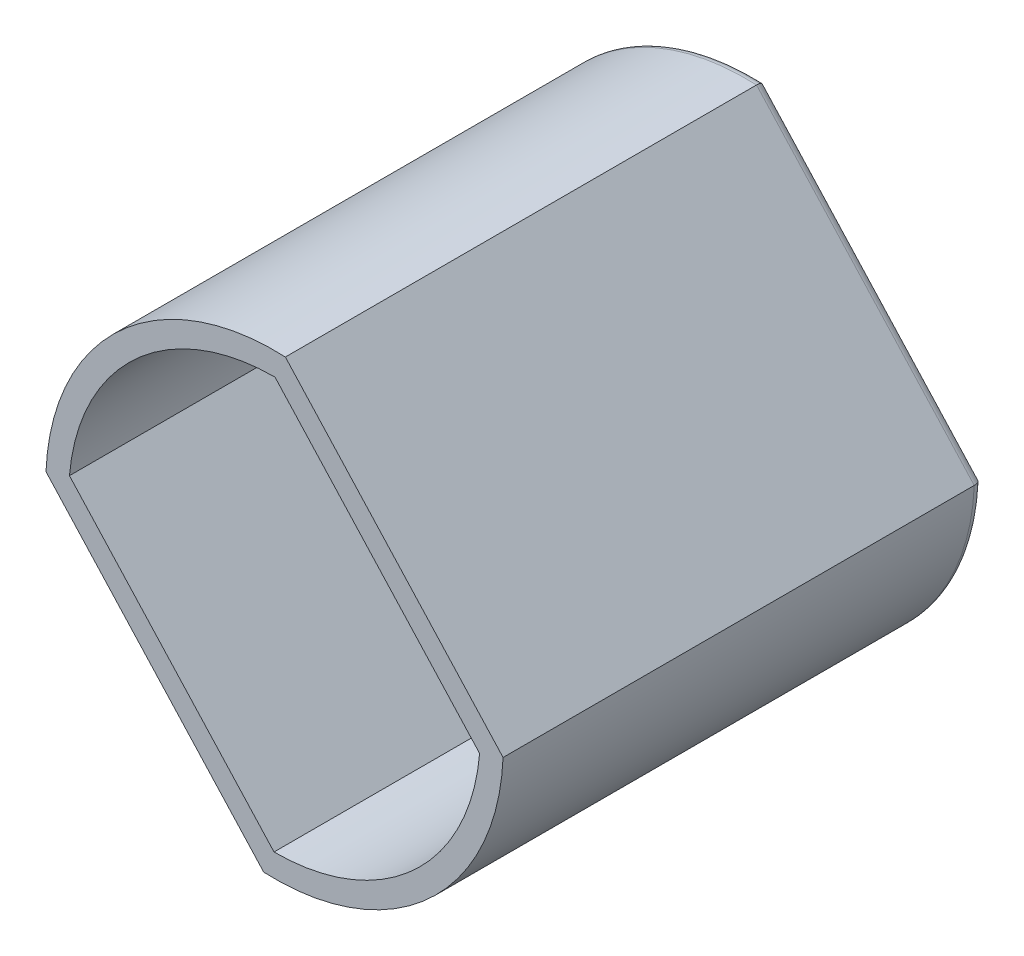
ISO-10303-21;
HEADER;
FILE_DESCRIPTION(('STEP AP214'),'2;1');
FILE_NAME('part.step','',(''),(''),'','','');
FILE_SCHEMA(('AUTOMOTIVE_DESIGN { 1 0 10303 214 1 1 1 1 }'));
ENDSEC;
DATA;
#1=APPLICATION_CONTEXT('core data for automotive mechanical design processes');
#2=APPLICATION_PROTOCOL_DEFINITION('international standard','automotive_design',2000,#1);
#3=PRODUCT_CONTEXT('',#1,'mechanical');
#4=PRODUCT('Part','Part','',(#3));
#5=PRODUCT_RELATED_PRODUCT_CATEGORY('part','',(#4));
#6=PRODUCT_DEFINITION_FORMATION('','',#4);
#7=PRODUCT_DEFINITION_CONTEXT('part definition',#1,'design');
#8=PRODUCT_DEFINITION('design','',#6,#7);
#9=PRODUCT_DEFINITION_SHAPE('','',#8);
#10=(LENGTH_UNIT() NAMED_UNIT(*) SI_UNIT(.MILLI.,.METRE.));
#11=(NAMED_UNIT(*) PLANE_ANGLE_UNIT() SI_UNIT($,.RADIAN.));
#12=(NAMED_UNIT(*) SI_UNIT($,.STERADIAN.) SOLID_ANGLE_UNIT());
#13=UNCERTAINTY_MEASURE_WITH_UNIT(LENGTH_MEASURE(1.E-05),#10,'distance_accuracy_value','');
#14=(GEOMETRIC_REPRESENTATION_CONTEXT(3) GLOBAL_UNCERTAINTY_ASSIGNED_CONTEXT((#13)) GLOBAL_UNIT_ASSIGNED_CONTEXT((#10,
#11,#12)) REPRESENTATION_CONTEXT('',''));
#15=CARTESIAN_POINT('',(0.,0.,0.));
#16=DIRECTION('',(0.,0.,1.));
#17=DIRECTION('',(1.,0.,0.));
#18=AXIS2_PLACEMENT_3D('',#15,#16,#17);
#19=CARTESIAN_POINT('',(0.,0.,-1.));
#20=DIRECTION('',(0.,0.,-1.));
#21=DIRECTION('',(-1.,0.,0.));
#22=AXIS2_PLACEMENT_3D('',#19,#20,#21);
#23=PLANE('',#22);
#24=CARTESIAN_POINT('',(0.,0.,-1.));
#25=DIRECTION('',(0.,0.,-1.));
#26=DIRECTION('',(-1.,0.,0.));
#27=AXIS2_PLACEMENT_3D('',#24,#25,#26);
#28=CIRCLE('',#27,9.6);
#29=CARTESIAN_POINT('',(9.58362211965735,-0.560523922428392,-1.));
#30=VERTEX_POINT('',#29);
#31=CARTESIAN_POINT('',(-0.290729810336729,-9.5955967077291,-1.));
#32=VERTEX_POINT('',#31);
#33=EDGE_CURVE('E175',#30,#32,#28,.T.);
#34=ORIENTED_EDGE('',*,*,#33,.T.);
#35=DIRECTION('',(-0.675057843193205,0.737764805573794,0.));
#36=VECTOR('',#35,1.);
#37=CARTESIAN_POINT('',(-9.69633375950913,0.683705486644895,-1.));
#38=LINE('',#37,#36);
#39=CARTESIAN_POINT('',(-9.58362211965735,0.560523922428391,-1.));
#40=VERTEX_POINT('',#39);
#41=EDGE_CURVE('E177',#32,#40,#38,.T.);
#42=ORIENTED_EDGE('',*,*,#41,.T.);
#43=CARTESIAN_POINT('',(0.,0.,-1.));
#44=DIRECTION('',(0.,0.,-1.));
#45=DIRECTION('',(-1.,0.,0.));
#46=AXIS2_PLACEMENT_3D('',#43,#44,#45);
#47=CIRCLE('',#46,9.6);
#48=CARTESIAN_POINT('',(0.29072981033673,9.5955967077291,-1.));
#49=VERTEX_POINT('',#48);
#50=EDGE_CURVE('E171',#40,#49,#47,.T.);
#51=ORIENTED_EDGE('',*,*,#50,.T.);
#52=DIRECTION('',(0.675057843193205,-0.737764805573794,0.));
#53=VECTOR('',#52,1.);
#54=CARTESIAN_POINT('',(9.69633375950913,-0.683705486644895,-1.));
#55=LINE('',#54,#53);
#56=EDGE_CURVE('E173',#49,#30,#55,.T.);
#57=ORIENTED_EDGE('',*,*,#56,.T.);
#58=EDGE_LOOP('',(#34,#42,#51,#57));
#59=FACE_BOUND('',#58,.T.);
#60=CARTESIAN_POINT('',(0.,0.,-1.));
#61=DIRECTION('',(0.,0.,-1.));
#62=DIRECTION('',(-1.,0.,0.));
#63=AXIS2_PLACEMENT_3D('',#60,#61,#62);
#64=CIRCLE('',#63,2.);
#65=CARTESIAN_POINT('',(-2.,0.,-1.));
#66=VERTEX_POINT('',#65);
#67=EDGE_CURVE('E348',#66,#66,#64,.T.);
#68=ORIENTED_EDGE('',*,*,#67,.F.);
#69=EDGE_LOOP('',(#68));
#70=FACE_BOUND('',#69,.T.);
#71=ADVANCED_FACE('F33',(#59,#70),#23,.T.);
#72=CARTESIAN_POINT('',(0.,0.,20.));
#73=DIRECTION('',(0.,0.,1.));
#74=DIRECTION('',(1.,0.,0.));
#75=AXIS2_PLACEMENT_3D('',#72,#73,#74);
#76=PLANE('',#75);
#77=CARTESIAN_POINT('',(0.,0.,20.));
#78=DIRECTION('',(0.,0.,1.));
#79=DIRECTION('',(1.,0.,0.));
#80=AXIS2_PLACEMENT_3D('',#77,#78,#79);
#81=CIRCLE('',#80,10.);
#82=CARTESIAN_POINT('',(0.473124092714464,9.98880140922289,20.));
#83=VERTEX_POINT('',#82);
#84=CARTESIAN_POINT('',(-9.99143968173865,0.413682349367613,20.));
#85=VERTEX_POINT('',#84);
#86=EDGE_CURVE('E153',#83,#85,#81,.T.);
#87=ORIENTED_EDGE('',*,*,#86,.T.);
#88=DIRECTION('',(0.675057843193205,-0.737764805573794,0.));
#89=VECTOR('',#88,1.);
#90=CARTESIAN_POINT('',(-9.99143968173865,0.413682349367613,20.));
#91=LINE('',#90,#89);
#92=CARTESIAN_POINT('',(-0.47312409271446,-9.98880140922289,20.));
#93=VERTEX_POINT('',#92);
#94=EDGE_CURVE('E156',#85,#93,#91,.T.);
#95=ORIENTED_EDGE('',*,*,#94,.T.);
#96=CARTESIAN_POINT('',(0.,0.,20.));
#97=DIRECTION('',(0.,0.,1.));
#98=DIRECTION('',(1.,0.,0.));
#99=AXIS2_PLACEMENT_3D('',#96,#97,#98);
#100=CIRCLE('',#99,10.);
#101=CARTESIAN_POINT('',(9.99143968173865,-0.413682349367619,20.));
#102=VERTEX_POINT('',#101);
#103=EDGE_CURVE('E158',#93,#102,#100,.T.);
#104=ORIENTED_EDGE('',*,*,#103,.T.);
#105=DIRECTION('',(-0.675057843193205,0.737764805573794,0.));
#106=VECTOR('',#105,1.);
#107=CARTESIAN_POINT('',(9.99143968173865,-0.413682349367613,20.));
#108=LINE('',#107,#106);
#109=EDGE_CURVE('E160',#102,#83,#108,.T.);
#110=ORIENTED_EDGE('',*,*,#109,.T.);
#111=EDGE_LOOP('',(#87,#95,#104,#110));
#112=FACE_BOUND('',#111,.T.);
#113=DIRECTION('',(0.675057843193205,-0.737764805573794,0.));
#114=VECTOR('',#113,1.);
#115=CARTESIAN_POINT('',(-8.96657257111127,0.77496859742505,20.));
#116=LINE('',#115,#114);
#117=CARTESIAN_POINT('',(-8.96657257111127,0.77496859742505,20.));
#118=VERTEX_POINT('',#117);
#119=CARTESIAN_POINT('',(-0.0224615921942456,-8.99997197089392,20.));
#120=VERTEX_POINT('',#119);
#121=EDGE_CURVE('E144',#118,#120,#116,.T.);
#122=ORIENTED_EDGE('',*,*,#121,.F.);
#123=CARTESIAN_POINT('',(0.,0.,20.));
#124=DIRECTION('',(0.,0.,1.));
#125=DIRECTION('',(1.,0.,0.));
#126=AXIS2_PLACEMENT_3D('',#123,#124,#125);
#127=CIRCLE('',#126,9.);
#128=CARTESIAN_POINT('',(0.0224615921942482,8.99997197089392,20.));
#129=VERTEX_POINT('',#128);
#130=EDGE_CURVE('E142',#129,#118,#127,.T.);
#131=ORIENTED_EDGE('',*,*,#130,.F.);
#132=DIRECTION('',(-0.675057843193205,0.737764805573794,0.));
#133=VECTOR('',#132,1.);
#134=CARTESIAN_POINT('',(8.96657257111127,-0.77496859742505,20.));
#135=LINE('',#134,#133);
#136=CARTESIAN_POINT('',(8.96657257111127,-0.774968597425052,20.));
#137=VERTEX_POINT('',#136);
#138=EDGE_CURVE('E124',#137,#129,#135,.T.);
#139=ORIENTED_EDGE('',*,*,#138,.F.);
#140=CARTESIAN_POINT('',(0.,0.,20.));
#141=DIRECTION('',(0.,0.,1.));
#142=DIRECTION('',(1.,0.,0.));
#143=AXIS2_PLACEMENT_3D('',#140,#141,#142);
#144=CIRCLE('',#143,9.);
#145=EDGE_CURVE('E357',#120,#137,#144,.T.);
#146=ORIENTED_EDGE('',*,*,#145,.F.);
#147=EDGE_LOOP('',(#122,#131,#139,#146));
#148=FACE_BOUND('',#147,.T.);
#149=ADVANCED_FACE('F232',(#112,#148),#76,.T.);
#150=CARTESIAN_POINT('',(0.,0.,20.));
#151=DIRECTION('',(0.,0.,-1.));
#152=DIRECTION('',(-1.,0.,0.));
#153=AXIS2_PLACEMENT_3D('',#150,#151,#152);
#154=CYLINDRICAL_SURFACE('',#153,10.);
#155=DIRECTION('',(0.,0.,-1.));
#156=VECTOR('',#155,1.);
#157=CARTESIAN_POINT('',(0.473124092714464,9.98880140922289,20.));
#158=LINE('',#157,#156);
#159=CARTESIAN_POINT('',(0.473124092714464,9.98880140922289,-0.6));
#160=VERTEX_POINT('',#159);
#161=EDGE_CURVE('E162',#83,#160,#158,.T.);
#162=ORIENTED_EDGE('',*,*,#161,.T.);
#163=CARTESIAN_POINT('',(0.,0.,-0.6));
#164=DIRECTION('',(0.,0.,-1.));
#165=DIRECTION('',(-1.,0.,0.));
#166=AXIS2_PLACEMENT_3D('',#163,#164,#165);
#167=CIRCLE('',#166,10.);
#168=CARTESIAN_POINT('',(-9.99143968173865,0.413682349367613,-0.6));
#169=VERTEX_POINT('',#168);
#170=EDGE_CURVE('E11',#160,#169,#167,.F.);
#171=ORIENTED_EDGE('',*,*,#170,.T.);
#172=DIRECTION('',(0.,0.,-1.));
#173=VECTOR('',#172,1.);
#174=CARTESIAN_POINT('',(-9.99143968173865,0.413682349367613,20.));
#175=LINE('',#174,#173);
#176=EDGE_CURVE('E168',#85,#169,#175,.T.);
#177=ORIENTED_EDGE('',*,*,#176,.F.);
#178=ORIENTED_EDGE('',*,*,#86,.F.);
#179=EDGE_LOOP('',(#162,#171,#177,#178));
#180=FACE_BOUND('',#179,.T.);
#181=ADVANCED_FACE('F236',(#180),#154,.T.);
#182=CARTESIAN_POINT('',(-9.99143968173865,0.413682349367613,20.));
#183=DIRECTION('',(0.737764805573794,0.675057843193205,0.));
#184=DIRECTION('',(-0.675057843193205,0.737764805573794,0.));
#185=AXIS2_PLACEMENT_3D('',#182,#183,#184);
#186=PLANE('',#185);
#187=ORIENTED_EDGE('',*,*,#176,.T.);
#188=DIRECTION('',(-0.675057843193205,0.737764805573794,0.));
#189=VECTOR('',#188,1.);
#190=CARTESIAN_POINT('',(-0.473124092714459,-9.98880140922289,-0.6));
#191=LINE('',#190,#189);
#192=CARTESIAN_POINT('',(-0.47312409271446,-9.98880140922289,-0.6));
#193=VERTEX_POINT('',#192);
#194=EDGE_CURVE('E180',#169,#193,#191,.F.);
#195=ORIENTED_EDGE('',*,*,#194,.T.);
#196=DIRECTION('',(0.,0.,-1.));
#197=VECTOR('',#196,1.);
#198=CARTESIAN_POINT('',(-0.47312409271446,-9.98880140922289,20.));
#199=LINE('',#198,#197);
#200=EDGE_CURVE('E166',#93,#193,#199,.T.);
#201=ORIENTED_EDGE('',*,*,#200,.F.);
#202=ORIENTED_EDGE('',*,*,#94,.F.);
#203=EDGE_LOOP('',(#187,#195,#201,#202));
#204=FACE_BOUND('',#203,.T.);
#205=ADVANCED_FACE('F226',(#204),#186,.F.);
#206=CARTESIAN_POINT('',(0.,0.,20.));
#207=DIRECTION('',(0.,0.,-1.));
#208=DIRECTION('',(-1.,0.,0.));
#209=AXIS2_PLACEMENT_3D('',#206,#207,#208);
#210=CYLINDRICAL_SURFACE('',#209,10.);
#211=ORIENTED_EDGE('',*,*,#200,.T.);
#212=CARTESIAN_POINT('',(0.,0.,-0.6));
#213=DIRECTION('',(0.,0.,-1.));
#214=DIRECTION('',(-1.,0.,0.));
#215=AXIS2_PLACEMENT_3D('',#212,#213,#214);
#216=CIRCLE('',#215,10.);
#217=CARTESIAN_POINT('',(9.99143968173865,-0.413682349367619,-0.6));
#218=VERTEX_POINT('',#217);
#219=EDGE_CURVE('E61',#193,#218,#216,.F.);
#220=ORIENTED_EDGE('',*,*,#219,.T.);
#221=DIRECTION('',(0.,0.,-1.));
#222=VECTOR('',#221,1.);
#223=CARTESIAN_POINT('',(9.99143968173865,-0.413682349367619,20.));
#224=LINE('',#223,#222);
#225=EDGE_CURVE('E164',#102,#218,#224,.T.);
#226=ORIENTED_EDGE('',*,*,#225,.F.);
#227=ORIENTED_EDGE('',*,*,#103,.F.);
#228=EDGE_LOOP('',(#211,#220,#226,#227));
#229=FACE_BOUND('',#228,.T.);
#230=ADVANCED_FACE('F229',(#229),#210,.T.);
#231=CARTESIAN_POINT('',(9.99143968173865,-0.413682349367613,20.));
#232=DIRECTION('',(-0.737764805573794,-0.675057843193205,0.));
#233=DIRECTION('',(0.675057843193205,-0.737764805573794,0.));
#234=AXIS2_PLACEMENT_3D('',#231,#232,#233);
#235=PLANE('',#234);
#236=ORIENTED_EDGE('',*,*,#225,.T.);
#237=DIRECTION('',(0.675057843193205,-0.737764805573794,0.));
#238=VECTOR('',#237,1.);
#239=CARTESIAN_POINT('',(0.473124092714463,9.98880140922289,-0.6));
#240=LINE('',#239,#238);
#241=EDGE_CURVE('E46',#218,#160,#240,.F.);
#242=ORIENTED_EDGE('',*,*,#241,.T.);
#243=ORIENTED_EDGE('',*,*,#161,.F.);
#244=ORIENTED_EDGE('',*,*,#109,.F.);
#245=EDGE_LOOP('',(#236,#242,#243,#244));
#246=FACE_BOUND('',#245,.T.);
#247=ADVANCED_FACE('F269',(#246),#235,.F.);
#248=CARTESIAN_POINT('',(0.,0.,20.));
#249=DIRECTION('',(0.,0.,-1.));
#250=DIRECTION('',(-1.,0.,0.));
#251=AXIS2_PLACEMENT_3D('',#248,#249,#250);
#252=CYLINDRICAL_SURFACE('',#251,9.);
#253=CARTESIAN_POINT('',(0.,0.,0.));
#254=DIRECTION('',(0.,0.,1.));
#255=DIRECTION('',(1.,0.,0.));
#256=AXIS2_PLACEMENT_3D('',#253,#254,#255);
#257=CIRCLE('',#256,9.);
#258=CARTESIAN_POINT('',(0.0224615921942499,8.99997197089392,0.));
#259=VERTEX_POINT('',#258);
#260=CARTESIAN_POINT('',(-8.96657257111127,0.77496859742505,0.));
#261=VERTEX_POINT('',#260);
#262=EDGE_CURVE('E131',#259,#261,#257,.T.);
#263=ORIENTED_EDGE('',*,*,#262,.F.);
#264=DIRECTION('',(0.,0.,-1.));
#265=VECTOR('',#264,1.);
#266=CARTESIAN_POINT('',(0.0224615921942482,8.99997197089392,20.));
#267=LINE('',#266,#265);
#268=EDGE_CURVE('E117',#129,#259,#267,.T.);
#269=ORIENTED_EDGE('',*,*,#268,.F.);
#270=ORIENTED_EDGE('',*,*,#130,.T.);
#271=DIRECTION('',(0.,0.,-1.));
#272=VECTOR('',#271,1.);
#273=CARTESIAN_POINT('',(-8.96657257111127,0.77496859742505,20.));
#274=LINE('',#273,#272);
#275=EDGE_CURVE('E134',#118,#261,#274,.T.);
#276=ORIENTED_EDGE('',*,*,#275,.T.);
#277=EDGE_LOOP('',(#263,#269,#270,#276));
#278=FACE_BOUND('',#277,.T.);
#279=ADVANCED_FACE('F132',(#278),#252,.F.);
#280=CARTESIAN_POINT('',(-8.96657257111127,0.77496859742505,20.));
#281=DIRECTION('',(0.737764805573794,0.675057843193205,0.));
#282=DIRECTION('',(-0.675057843193205,0.737764805573794,0.));
#283=AXIS2_PLACEMENT_3D('',#280,#281,#282);
#284=PLANE('',#283);
#285=DIRECTION('',(0.675057843193205,-0.737764805573794,0.));
#286=VECTOR('',#285,1.);
#287=CARTESIAN_POINT('',(-8.96657257111127,0.77496859742505,0.));
#288=LINE('',#287,#286);
#289=CARTESIAN_POINT('',(-0.0224615921942456,-8.99997197089392,0.));
#290=VERTEX_POINT('',#289);
#291=EDGE_CURVE('E137',#261,#290,#288,.T.);
#292=ORIENTED_EDGE('',*,*,#291,.F.);
#293=ORIENTED_EDGE('',*,*,#275,.F.);
#294=ORIENTED_EDGE('',*,*,#121,.T.);
#295=DIRECTION('',(0.,0.,-1.));
#296=VECTOR('',#295,1.);
#297=CARTESIAN_POINT('',(-0.0224615921942456,-8.99997197089392,20.));
#298=LINE('',#297,#296);
#299=EDGE_CURVE('E150',#120,#290,#298,.T.);
#300=ORIENTED_EDGE('',*,*,#299,.T.);
#301=EDGE_LOOP('',(#292,#293,#294,#300));
#302=FACE_BOUND('',#301,.T.);
#303=ADVANCED_FACE('F263',(#302),#284,.T.);
#304=CARTESIAN_POINT('',(0.,0.,20.));
#305=DIRECTION('',(0.,0.,-1.));
#306=DIRECTION('',(-1.,0.,0.));
#307=AXIS2_PLACEMENT_3D('',#304,#305,#306);
#308=CYLINDRICAL_SURFACE('',#307,9.);
#309=CARTESIAN_POINT('',(0.,0.,0.));
#310=DIRECTION('',(0.,0.,1.));
#311=DIRECTION('',(1.,0.,0.));
#312=AXIS2_PLACEMENT_3D('',#309,#310,#311);
#313=CIRCLE('',#312,9.);
#314=CARTESIAN_POINT('',(8.96657257111127,-0.774968597425052,0.));
#315=VERTEX_POINT('',#314);
#316=EDGE_CURVE('E141',#290,#315,#313,.T.);
#317=ORIENTED_EDGE('',*,*,#316,.F.);
#318=ORIENTED_EDGE('',*,*,#299,.F.);
#319=ORIENTED_EDGE('',*,*,#145,.T.);
#320=DIRECTION('',(0.,0.,-1.));
#321=VECTOR('',#320,1.);
#322=CARTESIAN_POINT('',(8.96657257111127,-0.774968597425052,20.));
#323=LINE('',#322,#321);
#324=EDGE_CURVE('E127',#137,#315,#323,.T.);
#325=ORIENTED_EDGE('',*,*,#324,.T.);
#326=EDGE_LOOP('',(#317,#318,#319,#325));
#327=FACE_BOUND('',#326,.T.);
#328=ADVANCED_FACE('F260',(#327),#308,.F.);
#329=CARTESIAN_POINT('',(8.96657257111127,-0.77496859742505,20.));
#330=DIRECTION('',(-0.737764805573794,-0.675057843193205,0.));
#331=DIRECTION('',(0.675057843193205,-0.737764805573794,0.));
#332=AXIS2_PLACEMENT_3D('',#329,#330,#331);
#333=PLANE('',#332);
#334=DIRECTION('',(-0.675057843193205,0.737764805573794,0.));
#335=VECTOR('',#334,1.);
#336=CARTESIAN_POINT('',(8.96657257111127,-0.77496859742505,0.));
#337=LINE('',#336,#335);
#338=EDGE_CURVE('E121',#315,#259,#337,.T.);
#339=ORIENTED_EDGE('',*,*,#338,.F.);
#340=ORIENTED_EDGE('',*,*,#324,.F.);
#341=ORIENTED_EDGE('',*,*,#138,.T.);
#342=ORIENTED_EDGE('',*,*,#268,.T.);
#343=EDGE_LOOP('',(#339,#340,#341,#342));
#344=FACE_BOUND('',#343,.T.);
#345=ADVANCED_FACE('F119',(#344),#333,.T.);
#346=CARTESIAN_POINT('',(0.,0.,0.));
#347=DIRECTION('',(0.,0.,-1.));
#348=DIRECTION('',(-1.,0.,0.));
#349=AXIS2_PLACEMENT_3D('',#346,#347,#348);
#350=PLANE('',#349);
#351=CARTESIAN_POINT('',(0.,0.,0.));
#352=DIRECTION('',(0.,0.,-1.));
#353=DIRECTION('',(-1.,0.,0.));
#354=AXIS2_PLACEMENT_3D('',#351,#352,#353);
#355=CIRCLE('',#354,0.75);
#356=CARTESIAN_POINT('',(-0.75,0.,0.));
#357=VERTEX_POINT('',#356);
#358=EDGE_CURVE('E347',#357,#357,#355,.T.);
#359=ORIENTED_EDGE('',*,*,#358,.T.);
#360=EDGE_LOOP('',(#359));
#361=FACE_BOUND('',#360,.T.);
#362=ORIENTED_EDGE('',*,*,#262,.T.);
#363=ORIENTED_EDGE('',*,*,#291,.T.);
#364=ORIENTED_EDGE('',*,*,#316,.T.);
#365=ORIENTED_EDGE('',*,*,#338,.T.);
#366=EDGE_LOOP('',(#362,#363,#364,#365));
#367=FACE_BOUND('',#366,.T.);
#368=ADVANCED_FACE('F139',(#361,#367),#350,.F.);
#369=CARTESIAN_POINT('',(4.93717596499704,4.51753639265036,-0.6));
#370=DIRECTION('',(-0.675057843193205,0.737764805573794,0.));
#371=DIRECTION('',(-0.737764805573794,-0.675057843193205,0.));
#372=AXIS2_PLACEMENT_3D('',#369,#370,#371);
#373=CYLINDRICAL_SURFACE('',#372,0.4);
#374=CARTESIAN_POINT('',(0.473124092714464,9.98880140922289,-0.6));
#375=CARTESIAN_POINT('',(0.473135354908186,9.9888245454219,-0.621274499510112));
#376=CARTESIAN_POINT('',(0.472345262635859,9.9871407854731,-0.642533611045299));
#377=CARTESIAN_POINT('',(0.469250481069887,9.98054077055174,-0.68437246932006));
#378=CARTESIAN_POINT('',(0.466949994055269,9.97563348418076,-0.704953935070556));
#379=CARTESIAN_POINT('',(0.460922423177762,9.96276754505887,-0.744908254364292));
#380=CARTESIAN_POINT('',(0.457195701286451,9.95480966653278,-0.764281413120382));
#381=CARTESIAN_POINT('',(0.448462469244883,9.93614431195264,-0.801342367498142));
#382=CARTESIAN_POINT('',(0.443455495289265,9.92543583941632,-0.819029549135127));
#383=CARTESIAN_POINT('',(0.432165860256305,9.90126397205951,-0.852829680601759));
#384=CARTESIAN_POINT('',(0.425848842310505,9.88772628373309,-0.868877872224136));
#385=CARTESIAN_POINT('',(0.412247956132091,9.85854028066471,-0.89844387053703));
#386=CARTESIAN_POINT('',(0.404963771250175,9.8428912746527,-0.911960845001566));
#387=CARTESIAN_POINT('',(0.389089268449497,9.80873680619059,-0.937109730026041));
#388=CARTESIAN_POINT('',(0.380442753119126,9.7901069976509,-0.948537067218891));
#389=CARTESIAN_POINT('',(0.362529679268144,9.75144476539199,-0.96805096722532));
#390=CARTESIAN_POINT('',(0.353262923372954,9.73141189509175,-0.976136460659108));
#391=CARTESIAN_POINT('',(0.335473049097134,9.69288378563349,-0.988110339505884));
#392=CARTESIAN_POINT('',(0.326991344293538,9.67448633653254,-0.992381611184028));
#393=CARTESIAN_POINT('',(0.309900793848791,9.63735455721769,-0.998208599948867));
#394=CARTESIAN_POINT('',(0.301292227283515,9.61862095107151,-0.999769577581643));
#395=CARTESIAN_POINT('',(0.292042755252196,9.59845917892348,-0.999992127492424));
#396=CARTESIAN_POINT('',(0.291386217401229,9.5970278920125,-1.00000001868753));
#397=CARTESIAN_POINT('',(0.290729810336731,9.59559670772911,-1.));
#398=B_SPLINE_CURVE_WITH_KNOTS('',3,(#374,#375,#376,#377,#378,#379,#380,#381,#382,#383,#384,
#385,#386,#387,#388,#389,#390,#391,#392,#393,#394,#395,#396,#397),.UNSPECIFIED.,.F.,.F.,(4,2,2,
2,2,2,2,2,2,2,2,4),(0.,0.0637184936435215,0.127260454215003,0.190786298824412,0.254335190048459,
0.319829278772935,0.385344863301996,0.45555663010262,0.525790847091586,0.587730982858975,
0.649550760941756,0.654274774117068),.UNSPECIFIED.);
#399=EDGE_CURVE('E207',#160,#49,#398,.T.);
#400=ORIENTED_EDGE('',*,*,#399,.F.);
#401=ORIENTED_EDGE('',*,*,#241,.F.);
#402=CARTESIAN_POINT('',(9.99143968173865,-0.413682349367619,-0.6));
#403=CARTESIAN_POINT('',(9.99146372472307,-0.413673181182848,-0.621274499510113));
#404=CARTESIAN_POINT('',(9.98971658830313,-0.414310995963221,-0.642533611045299));
#405=CARTESIAN_POINT('',(9.98286834720636,-0.416808887831147,-0.68437246932006));
#406=CARTESIAN_POINT('',(9.97777654816106,-0.418665573726364,-0.704953935070556));
#407=CARTESIAN_POINT('',(9.96442719450125,-0.423529600559831,-0.744908254364292));
#408=CARTESIAN_POINT('',(9.95617044313562,-0.426536649541365,-0.764281413120383));
#409=CARTESIAN_POINT('',(9.93680477341601,-0.433581906087821,-0.801342367498143));
#410=CARTESIAN_POINT('',(9.92569482140781,-0.437620487352176,-0.819029549135127));
#411=CARTESIAN_POINT('',(9.90061780992006,-0.446724251712915,-0.852829680601759));
#412=CARTESIAN_POINT('',(9.88657370526265,-0.451817074635697,-0.868877872224136));
#413=CARTESIAN_POINT('',(9.85629751190262,-0.462778780505275,-0.89844387053703));
#414=CARTESIAN_POINT('',(9.84006470659494,-0.468647917614001,-0.911960845001567));
#415=CARTESIAN_POINT('',(9.80463815628336,-0.48143412456208,-0.937109730026041));
#416=CARTESIAN_POINT('',(9.78531557539579,-0.488396154540983,-0.948537067218891));
#417=CARTESIAN_POINT('',(9.74521838176009,-0.502813556545964,-0.96805096722532));
#418=CARTESIAN_POINT('',(9.72444330670079,-0.510269085606195,-0.976136460659108));
#419=CARTESIAN_POINT('',(9.68449062319359,-0.524575654927651,-0.988110339505884));
#420=CARTESIAN_POINT('',(9.66541408926313,-0.531394108051173,-0.992381611184028));
#421=CARTESIAN_POINT('',(9.62691420106872,-0.545127809613709,-0.998208599948867));
#422=CARTESIAN_POINT('',(9.60749159274972,-0.552042844222142,-0.999769577581643));
#423=CARTESIAN_POINT('',(9.58658965394918,-0.559469737474785,-0.999992127492424));
#424=CARTESIAN_POINT('',(9.58510582989781,-0.559996890541602,-1.00000001868753));
#425=CARTESIAN_POINT('',(9.58362211965735,-0.560523922428393,-1.));
#426=B_SPLINE_CURVE_WITH_KNOTS('',3,(#402,#403,#404,#405,#406,#407,#408,#409,#410,#411,#412,
#413,#414,#415,#416,#417,#418,#419,#420,#421,#422,#423,#424,#425),.UNSPECIFIED.,.F.,.F.,(4,2,2,
2,2,2,2,2,2,2,2,4),(0.,0.063718493643522,0.127260454215003,0.190786298824412,0.25433519004846,
0.319829278772934,0.385344863301997,0.45555663010262,0.525790847091585,0.587730982858974,
0.649550760941756,0.654274774117068),.UNSPECIFIED.);
#427=EDGE_CURVE('E38',#30,#218,#426,.F.);
#428=ORIENTED_EDGE('',*,*,#427,.F.);
#429=ORIENTED_EDGE('',*,*,#56,.F.);
#430=EDGE_LOOP('',(#400,#401,#428,#429));
#431=FACE_BOUND('',#430,.T.);
#432=ADVANCED_FACE('F35',(#431),#373,.T.);
#433=CARTESIAN_POINT('',(0.,0.,-0.6));
#434=DIRECTION('',(0.,0.,-1.));
#435=DIRECTION('',(-1.,0.,0.));
#436=AXIS2_PLACEMENT_3D('',#433,#434,#435);
#437=TOROIDAL_SURFACE('',#436,9.6,0.4);
#438=ORIENTED_EDGE('',*,*,#427,.T.);
#439=ORIENTED_EDGE('',*,*,#219,.F.);
#440=CARTESIAN_POINT('',(-0.47312409271446,-9.98880140922289,-0.6));
#441=CARTESIAN_POINT('',(-0.473135354908184,-9.9888245454219,-0.621274499510112));
#442=CARTESIAN_POINT('',(-0.472345262635857,-9.9871407854731,-0.642533611045299));
#443=CARTESIAN_POINT('',(-0.469250481069886,-9.98054077055174,-0.68437246932006));
#444=CARTESIAN_POINT('',(-0.466949994055268,-9.97563348418076,-0.704953935070556));
#445=CARTESIAN_POINT('',(-0.460922423177761,-9.96276754505887,-0.744908254364292));
#446=CARTESIAN_POINT('',(-0.457195701286451,-9.95480966653278,-0.764281413120382));
#447=CARTESIAN_POINT('',(-0.448462469244883,-9.93614431195264,-0.801342367498143));
#448=CARTESIAN_POINT('',(-0.443455495289263,-9.92543583941632,-0.819029549135127));
#449=CARTESIAN_POINT('',(-0.432165860256303,-9.90126397205951,-0.852829680601758));
#450=CARTESIAN_POINT('',(-0.425848842310505,-9.88772628373309,-0.868877872224135));
#451=CARTESIAN_POINT('',(-0.412247956132091,-9.85854028066471,-0.898443870537029));
#452=CARTESIAN_POINT('',(-0.404963771250174,-9.8428912746527,-0.911960845001566));
#453=CARTESIAN_POINT('',(-0.389089268449495,-9.80873680619059,-0.937109730026041));
#454=CARTESIAN_POINT('',(-0.380442753119125,-9.7901069976509,-0.948537067218891));
#455=CARTESIAN_POINT('',(-0.362529679268141,-9.75144476539199,-0.96805096722532));
#456=CARTESIAN_POINT('',(-0.35326292337295,-9.73141189509175,-0.976136460659109));
#457=CARTESIAN_POINT('',(-0.335473049097135,-9.69288378563349,-0.988110339505884));
#458=CARTESIAN_POINT('',(-0.326991344293544,-9.67448633653253,-0.992381611184028));
#459=CARTESIAN_POINT('',(-0.309900793848785,-9.6373545572177,-0.998208599948867));
#460=CARTESIAN_POINT('',(-0.301292227283493,-9.61862095107152,-0.999769577581643));
#461=CARTESIAN_POINT('',(-0.292042755252192,-9.59845917892348,-0.999992127492424));
#462=CARTESIAN_POINT('',(-0.291386217401226,-9.59702789201249,-1.00000001868753));
#463=CARTESIAN_POINT('',(-0.29072981033673,-9.5955967077291,-1.));
#464=B_SPLINE_CURVE_WITH_KNOTS('',3,(#440,#441,#442,#443,#444,#445,#446,#447,#448,#449,#450,
#451,#452,#453,#454,#455,#456,#457,#458,#459,#460,#461,#462,#463),.UNSPECIFIED.,.F.,.F.,(4,2,2,
2,2,2,2,2,2,2,2,4),(0.,0.0637184936435214,0.127260454215003,0.190786298824412,0.254335190048458,
0.319829278772934,0.385344863301996,0.45555663010262,0.525790847091586,0.587730982858974,
0.649550760941755,0.654274774117071),.UNSPECIFIED.);
#465=EDGE_CURVE('E192',#32,#193,#464,.F.);
#466=ORIENTED_EDGE('',*,*,#465,.F.);
#467=ORIENTED_EDGE('',*,*,#33,.F.);
#468=EDGE_LOOP('',(#438,#439,#466,#467));
#469=FACE_BOUND('',#468,.T.);
#470=ADVANCED_FACE('F203',(#469),#437,.T.);
#471=CARTESIAN_POINT('',(0.,0.,-0.6));
#472=DIRECTION('',(0.,0.,-1.));
#473=DIRECTION('',(-1.,0.,0.));
#474=AXIS2_PLACEMENT_3D('',#471,#472,#473);
#475=TOROIDAL_SURFACE('',#474,9.6,0.4);
#476=ORIENTED_EDGE('',*,*,#399,.T.);
#477=ORIENTED_EDGE('',*,*,#50,.F.);
#478=CARTESIAN_POINT('',(-9.99143968173865,0.413682349367613,-0.6));
#479=CARTESIAN_POINT('',(-9.99146372472307,0.413673181182844,-0.621274499510113));
#480=CARTESIAN_POINT('',(-9.98971658830313,0.414310995963219,-0.642533611045299));
#481=CARTESIAN_POINT('',(-9.98286834720636,0.416808887831145,-0.68437246932006));
#482=CARTESIAN_POINT('',(-9.97777654816106,0.418665573726362,-0.704953935070556));
#483=CARTESIAN_POINT('',(-9.96442719450125,0.423529600559829,-0.744908254364292));
#484=CARTESIAN_POINT('',(-9.95617044313562,0.426536649541364,-0.764281413120382));
#485=CARTESIAN_POINT('',(-9.93680477341601,0.433581906087819,-0.801342367498143));
#486=CARTESIAN_POINT('',(-9.92569482140781,0.437620487352174,-0.819029549135127));
#487=CARTESIAN_POINT('',(-9.90061780992006,0.446724251712912,-0.852829680601758));
#488=CARTESIAN_POINT('',(-9.88657370526265,0.451817074635695,-0.868877872224136));
#489=CARTESIAN_POINT('',(-9.85629751190262,0.462778780505273,-0.89844387053703));
#490=CARTESIAN_POINT('',(-9.84006470659494,0.468647917613999,-0.911960845001567));
#491=CARTESIAN_POINT('',(-9.80463815628336,0.481434124562078,-0.937109730026041));
#492=CARTESIAN_POINT('',(-9.7853155753958,0.488396154540983,-0.948537067218891));
#493=CARTESIAN_POINT('',(-9.74521838176009,0.502813556545964,-0.968050967225319));
#494=CARTESIAN_POINT('',(-9.72444330670079,0.510269085606193,-0.976136460659108));
#495=CARTESIAN_POINT('',(-9.68449062319359,0.524575654927649,-0.988110339505884));
#496=CARTESIAN_POINT('',(-9.66541408926313,0.531394108051172,-0.992381611184028));
#497=CARTESIAN_POINT('',(-9.62691420106872,0.545127809613707,-0.998208599948867));
#498=CARTESIAN_POINT('',(-9.60749159274972,0.552042844222137,-0.999769577581643));
#499=CARTESIAN_POINT('',(-9.58658965394918,0.559469737474783,-0.999992127492424));
#500=CARTESIAN_POINT('',(-9.5851058298978,0.5599968905416,-1.00000001868753));
#501=CARTESIAN_POINT('',(-9.58362211965734,0.560523922428391,-1.));
#502=B_SPLINE_CURVE_WITH_KNOTS('',3,(#478,#479,#480,#481,#482,#483,#484,#485,#486,#487,#488,
#489,#490,#491,#492,#493,#494,#495,#496,#497,#498,#499,#500,#501),.UNSPECIFIED.,.F.,.F.,(4,2,2,
2,2,2,2,2,2,2,2,4),(0.,0.0637184936435219,0.127260454215003,0.190786298824412,0.254335190048459,
0.319829278772934,0.385344863301995,0.455556630102619,0.525790847091583,0.587730982858973,
0.649550760941758,0.654274774117071),.UNSPECIFIED.);
#503=EDGE_CURVE('E185',#169,#40,#502,.T.);
#504=ORIENTED_EDGE('',*,*,#503,.F.);
#505=ORIENTED_EDGE('',*,*,#170,.F.);
#506=EDGE_LOOP('',(#476,#477,#504,#505));
#507=FACE_BOUND('',#506,.T.);
#508=ADVANCED_FACE('F200',(#507),#475,.T.);
#509=CARTESIAN_POINT('',(-4.93717596499704,-4.51753639265036,-0.6));
#510=DIRECTION('',(0.675057843193205,-0.737764805573794,0.));
#511=DIRECTION('',(0.737764805573794,0.675057843193205,0.));
#512=AXIS2_PLACEMENT_3D('',#509,#510,#511);
#513=CYLINDRICAL_SURFACE('',#512,0.4);
#514=ORIENTED_EDGE('',*,*,#465,.T.);
#515=ORIENTED_EDGE('',*,*,#194,.F.);
#516=ORIENTED_EDGE('',*,*,#503,.T.);
#517=ORIENTED_EDGE('',*,*,#41,.F.);
#518=EDGE_LOOP('',(#514,#515,#516,#517));
#519=FACE_BOUND('',#518,.T.);
#520=ADVANCED_FACE('F197',(#519),#513,.T.);
#521=CARTESIAN_POINT('',(0.,0.,-2.));
#522=DIRECTION('',(0.,0.,1.));
#523=DIRECTION('',(1.,0.,0.));
#524=AXIS2_PLACEMENT_3D('',#521,#522,#523);
#525=CYLINDRICAL_SURFACE('',#524,2.);
#526=CARTESIAN_POINT('',(0.,0.,-2.));
#527=DIRECTION('',(0.,0.,-1.));
#528=DIRECTION('',(-1.,0.,0.));
#529=AXIS2_PLACEMENT_3D('',#526,#527,#528);
#530=CIRCLE('',#529,2.);
#531=CARTESIAN_POINT('',(-2.,0.,-2.));
#532=VERTEX_POINT('',#531);
#533=EDGE_CURVE('E193',#532,#532,#530,.T.);
#534=ORIENTED_EDGE('',*,*,#533,.F.);
#535=EDGE_LOOP('',(#534));
#536=FACE_BOUND('',#535,.T.);
#537=ORIENTED_EDGE('',*,*,#67,.T.);
#538=EDGE_LOOP('',(#537));
#539=FACE_BOUND('',#538,.T.);
#540=ADVANCED_FACE('F255',(#536,#539),#525,.T.);
#541=CARTESIAN_POINT('',(0.,0.,-2.));
#542=DIRECTION('',(0.,0.,-1.));
#543=DIRECTION('',(-1.,0.,0.));
#544=AXIS2_PLACEMENT_3D('',#541,#542,#543);
#545=PLANE('',#544);
#546=CARTESIAN_POINT('',(0.,0.,-2.));
#547=DIRECTION('',(0.,0.,-1.));
#548=DIRECTION('',(-1.,0.,0.));
#549=AXIS2_PLACEMENT_3D('',#546,#547,#548);
#550=CIRCLE('',#549,0.75);
#551=CARTESIAN_POINT('',(-0.75,0.,-2.));
#552=VERTEX_POINT('',#551);
#553=EDGE_CURVE('E344',#552,#552,#550,.T.);
#554=ORIENTED_EDGE('',*,*,#553,.F.);
#555=EDGE_LOOP('',(#554));
#556=FACE_BOUND('',#555,.T.);
#557=ORIENTED_EDGE('',*,*,#533,.T.);
#558=EDGE_LOOP('',(#557));
#559=FACE_BOUND('',#558,.T.);
#560=ADVANCED_FACE('F323',(#556,#559),#545,.T.);
#561=CARTESIAN_POINT('',(0.,0.,20.));
#562=DIRECTION('',(0.,0.,-1.));
#563=DIRECTION('',(-1.,0.,0.));
#564=AXIS2_PLACEMENT_3D('',#561,#562,#563);
#565=CYLINDRICAL_SURFACE('',#564,0.75);
#566=ORIENTED_EDGE('',*,*,#553,.T.);
#567=EDGE_LOOP('',(#566));
#568=FACE_BOUND('',#567,.T.);
#569=ORIENTED_EDGE('',*,*,#358,.F.);
#570=EDGE_LOOP('',(#569));
#571=FACE_BOUND('',#570,.T.);
#572=ADVANCED_FACE('F328',(#568,#571),#565,.F.);
#573=CLOSED_SHELL('',(#71,#149,#181,#205,#230,#247,#279,#303,#328,#345,#368,#432,#470,#508,#520,
#540,#560,#572));
#574=MANIFOLD_SOLID_BREP('B2',#573);
#575=ADVANCED_BREP_SHAPE_REPRESENTATION('',(#18,#574),#14);
#576=SHAPE_DEFINITION_REPRESENTATION(#9,#575);
ENDSEC;
END-ISO-10303-21;
